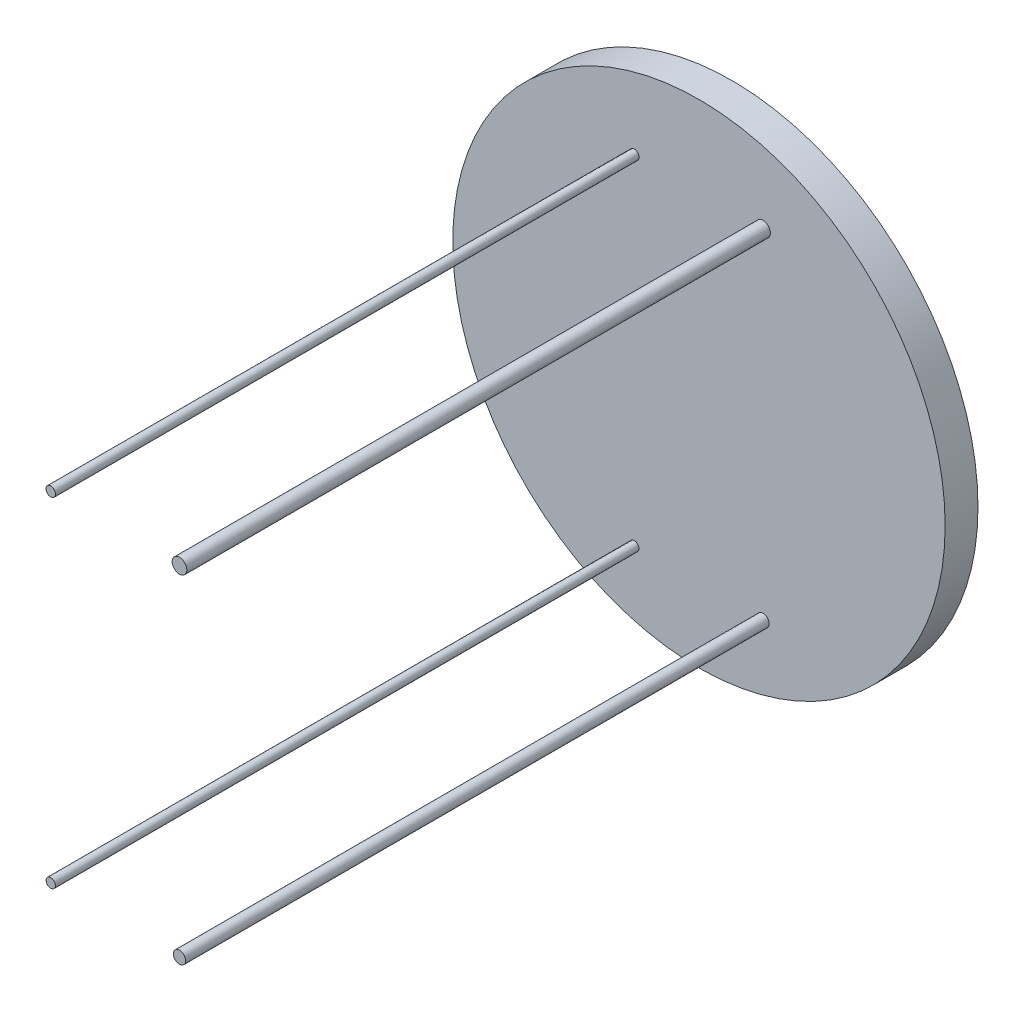
ISO-10303-21;
HEADER;
FILE_DESCRIPTION(('STEP AP214'),'2;1');
FILE_NAME('part.step','',(''),(''),'','','');
FILE_SCHEMA(('AUTOMOTIVE_DESIGN { 1 0 10303 214 1 1 1 1 }'));
ENDSEC;
DATA;
#1=APPLICATION_CONTEXT('core data for automotive mechanical design processes');
#2=APPLICATION_PROTOCOL_DEFINITION('international standard','automotive_design',2000,#1);
#3=PRODUCT_CONTEXT('',#1,'mechanical');
#4=PRODUCT('Part','Part','',(#3));
#5=PRODUCT_RELATED_PRODUCT_CATEGORY('part','',(#4));
#6=PRODUCT_DEFINITION_FORMATION('','',#4);
#7=PRODUCT_DEFINITION_CONTEXT('part definition',#1,'design');
#8=PRODUCT_DEFINITION('design','',#6,#7);
#9=PRODUCT_DEFINITION_SHAPE('','',#8);
#10=(LENGTH_UNIT() NAMED_UNIT(*) SI_UNIT(.MILLI.,.METRE.));
#11=(NAMED_UNIT(*) PLANE_ANGLE_UNIT() SI_UNIT($,.RADIAN.));
#12=(NAMED_UNIT(*) SI_UNIT($,.STERADIAN.) SOLID_ANGLE_UNIT());
#13=UNCERTAINTY_MEASURE_WITH_UNIT(LENGTH_MEASURE(1.E-05),#10,'distance_accuracy_value','');
#14=(GEOMETRIC_REPRESENTATION_CONTEXT(3) GLOBAL_UNCERTAINTY_ASSIGNED_CONTEXT((#13)) GLOBAL_UNIT_ASSIGNED_CONTEXT((#10,
#11,#12)) REPRESENTATION_CONTEXT('',''));
#15=CARTESIAN_POINT('',(0.,0.,0.));
#16=DIRECTION('',(0.,0.,1.));
#17=DIRECTION('',(1.,0.,0.));
#18=AXIS2_PLACEMENT_3D('',#15,#16,#17);
#19=CARTESIAN_POINT('',(833.930631375601,-1197.16637306014,769.51077616825));
#20=DIRECTION('',(0.,0.,1.));
#21=DIRECTION('',(1.,0.,0.));
#22=AXIS2_PLACEMENT_3D('',#19,#20,#21);
#23=CYLINDRICAL_SURFACE('',#22,1304.09277986268);
#24=CARTESIAN_POINT('',(833.930631375601,-1197.16637306014,769.51077616825));
#25=DIRECTION('',(0.,0.,1.));
#26=DIRECTION('',(1.,0.,0.));
#27=AXIS2_PLACEMENT_3D('',#24,#25,#26);
#28=CIRCLE('',#27,1304.09277986268);
#29=CARTESIAN_POINT('',(2138.02341123828,-1197.16637306014,769.51077616825));
#30=VERTEX_POINT('',#29);
#31=EDGE_CURVE('E10',#30,#30,#28,.T.);
#32=ORIENTED_EDGE('',*,*,#31,.T.);
#33=EDGE_LOOP('',(#32));
#34=FACE_BOUND('',#33,.T.);
#35=CARTESIAN_POINT('',(833.930631375601,-1197.16637306014,943.51077616825));
#36=DIRECTION('',(0.,0.,1.));
#37=DIRECTION('',(1.,0.,0.));
#38=AXIS2_PLACEMENT_3D('',#35,#36,#37);
#39=CIRCLE('',#38,1304.09277986268);
#40=CARTESIAN_POINT('',(2138.02341123828,-1197.16637306014,943.51077616825));
#41=VERTEX_POINT('',#40);
#42=EDGE_CURVE('E40',#41,#41,#39,.T.);
#43=ORIENTED_EDGE('',*,*,#42,.F.);
#44=EDGE_LOOP('',(#43));
#45=FACE_BOUND('',#44,.T.);
#46=ADVANCED_FACE('F37',(#34,#45),#23,.T.);
#47=CARTESIAN_POINT('',(833.930631375601,-1197.16637306014,769.51077616825));
#48=DIRECTION('',(0.,0.,1.));
#49=DIRECTION('',(1.,0.,0.));
#50=AXIS2_PLACEMENT_3D('',#47,#48,#49);
#51=PLANE('',#50);
#52=ORIENTED_EDGE('',*,*,#31,.F.);
#53=EDGE_LOOP('',(#52));
#54=FACE_BOUND('',#53,.T.);
#55=ADVANCED_FACE('F96',(#54),#51,.F.);
#56=CARTESIAN_POINT('',(833.930631375601,-1197.16637306014,943.51077616825));
#57=DIRECTION('',(0.,0.,1.));
#58=DIRECTION('',(1.,0.,0.));
#59=AXIS2_PLACEMENT_3D('',#56,#57,#58);
#60=PLANE('',#59);
#61=CARTESIAN_POINT('',(1173.63922552686,-2112.86084923489,943.51077616825));
#62=DIRECTION('',(0.,0.,1.));
#63=DIRECTION('',(1.,0.,0.));
#64=AXIS2_PLACEMENT_3D('',#61,#62,#63);
#65=CIRCLE('',#64,32.2544928425061);
#66=CARTESIAN_POINT('',(1205.89371836936,-2112.86084923489,943.51077616825));
#67=VERTEX_POINT('',#66);
#68=EDGE_CURVE('E75',#67,#67,#65,.T.);
#69=ORIENTED_EDGE('',*,*,#68,.F.);
#70=EDGE_LOOP('',(#69));
#71=FACE_BOUND('',#70,.T.);
#72=CARTESIAN_POINT('',(491.765116757733,-2112.86084923489,943.51077616825));
#73=DIRECTION('',(0.,0.,1.));
#74=DIRECTION('',(1.,0.,0.));
#75=AXIS2_PLACEMENT_3D('',#72,#73,#74);
#76=CIRCLE('',#75,24.5210757220367);
#77=CARTESIAN_POINT('',(516.28619247977,-2112.86084923489,943.51077616825));
#78=VERTEX_POINT('',#77);
#79=EDGE_CURVE('E67',#78,#78,#76,.T.);
#80=ORIENTED_EDGE('',*,*,#79,.F.);
#81=EDGE_LOOP('',(#80));
#82=FACE_BOUND('',#81,.T.);
#83=CARTESIAN_POINT('',(491.765116757733,-317.201613393006,943.51077616825));
#84=DIRECTION('',(0.,0.,1.));
#85=DIRECTION('',(1.,0.,0.));
#86=AXIS2_PLACEMENT_3D('',#83,#84,#85);
#87=CIRCLE('',#86,25.1929811721061);
#88=CARTESIAN_POINT('',(516.958097929839,-317.201613393006,943.51077616825));
#89=VERTEX_POINT('',#88);
#90=EDGE_CURVE('E59',#89,#89,#87,.T.);
#91=ORIENTED_EDGE('',*,*,#90,.F.);
#92=EDGE_LOOP('',(#91));
#93=FACE_BOUND('',#92,.T.);
#94=CARTESIAN_POINT('',(1173.63922552686,-317.201613393006,943.51077616825));
#95=DIRECTION('',(0.,0.,1.));
#96=DIRECTION('',(1.,0.,0.));
#97=AXIS2_PLACEMENT_3D('',#94,#95,#96);
#98=CIRCLE('',#97,38.7717152851179);
#99=CARTESIAN_POINT('',(1212.41094081198,-317.201613393006,943.51077616825));
#100=VERTEX_POINT('',#99);
#101=EDGE_CURVE('E51',#100,#100,#98,.T.);
#102=ORIENTED_EDGE('',*,*,#101,.F.);
#103=EDGE_LOOP('',(#102));
#104=FACE_BOUND('',#103,.T.);
#105=ORIENTED_EDGE('',*,*,#42,.T.);
#106=EDGE_LOOP('',(#105));
#107=FACE_BOUND('',#106,.T.);
#108=ADVANCED_FACE('F92',(#71,#82,#93,#104,#107),#60,.T.);
#109=CARTESIAN_POINT('',(1173.63922552686,-317.201613393006,4034.51077616825));
#110=DIRECTION('',(0.,0.,-1.));
#111=DIRECTION('',(-1.,0.,0.));
#112=AXIS2_PLACEMENT_3D('',#109,#110,#111);
#113=CYLINDRICAL_SURFACE('',#112,38.7717152851179);
#114=CARTESIAN_POINT('',(1173.63922552686,-317.201613393006,4034.51077616825));
#115=DIRECTION('',(0.,0.,1.));
#116=DIRECTION('',(1.,0.,0.));
#117=AXIS2_PLACEMENT_3D('',#114,#115,#116);
#118=CIRCLE('',#117,38.7717152851179);
#119=CARTESIAN_POINT('',(1212.41094081198,-317.201613393006,4034.51077616825));
#120=VERTEX_POINT('',#119);
#121=EDGE_CURVE('E49',#120,#120,#118,.T.);
#122=ORIENTED_EDGE('',*,*,#121,.F.);
#123=EDGE_LOOP('',(#122));
#124=FACE_BOUND('',#123,.T.);
#125=ORIENTED_EDGE('',*,*,#101,.T.);
#126=EDGE_LOOP('',(#125));
#127=FACE_BOUND('',#126,.T.);
#128=ADVANCED_FACE('F95',(#124,#127),#113,.T.);
#129=CARTESIAN_POINT('',(1173.63922552686,-317.201613393006,4034.51077616825));
#130=DIRECTION('',(0.,0.,1.));
#131=DIRECTION('',(1.,0.,0.));
#132=AXIS2_PLACEMENT_3D('',#129,#130,#131);
#133=PLANE('',#132);
#134=ORIENTED_EDGE('',*,*,#121,.T.);
#135=EDGE_LOOP('',(#134));
#136=FACE_BOUND('',#135,.T.);
#137=ADVANCED_FACE('F117',(#136),#133,.T.);
#138=CARTESIAN_POINT('',(491.765116757733,-317.201613393006,4034.51077616825));
#139=DIRECTION('',(0.,0.,-1.));
#140=DIRECTION('',(-1.,0.,0.));
#141=AXIS2_PLACEMENT_3D('',#138,#139,#140);
#142=CYLINDRICAL_SURFACE('',#141,25.1929811721061);
#143=CARTESIAN_POINT('',(491.765116757733,-317.201613393006,4034.51077616825));
#144=DIRECTION('',(0.,0.,1.));
#145=DIRECTION('',(1.,0.,0.));
#146=AXIS2_PLACEMENT_3D('',#143,#144,#145);
#147=CIRCLE('',#146,25.1929811721061);
#148=CARTESIAN_POINT('',(516.958097929839,-317.201613393006,4034.51077616825));
#149=VERTEX_POINT('',#148);
#150=EDGE_CURVE('E55',#149,#149,#147,.T.);
#151=ORIENTED_EDGE('',*,*,#150,.F.);
#152=EDGE_LOOP('',(#151));
#153=FACE_BOUND('',#152,.T.);
#154=ORIENTED_EDGE('',*,*,#90,.T.);
#155=EDGE_LOOP('',(#154));
#156=FACE_BOUND('',#155,.T.);
#157=ADVANCED_FACE('F121',(#153,#156),#142,.T.);
#158=CARTESIAN_POINT('',(491.765116757733,-317.201613393006,4034.51077616825));
#159=DIRECTION('',(0.,0.,1.));
#160=DIRECTION('',(1.,0.,0.));
#161=AXIS2_PLACEMENT_3D('',#158,#159,#160);
#162=PLANE('',#161);
#163=ORIENTED_EDGE('',*,*,#150,.T.);
#164=EDGE_LOOP('',(#163));
#165=FACE_BOUND('',#164,.T.);
#166=ADVANCED_FACE('F125',(#165),#162,.T.);
#167=CARTESIAN_POINT('',(491.765116757733,-2112.86084923489,4034.51077616825));
#168=DIRECTION('',(0.,0.,-1.));
#169=DIRECTION('',(-1.,0.,0.));
#170=AXIS2_PLACEMENT_3D('',#167,#168,#169);
#171=CYLINDRICAL_SURFACE('',#170,24.5210757220367);
#172=CARTESIAN_POINT('',(491.765116757733,-2112.86084923489,4034.51077616825));
#173=DIRECTION('',(0.,0.,1.));
#174=DIRECTION('',(1.,0.,0.));
#175=AXIS2_PLACEMENT_3D('',#172,#173,#174);
#176=CIRCLE('',#175,24.5210757220367);
#177=CARTESIAN_POINT('',(516.28619247977,-2112.86084923489,4034.51077616825));
#178=VERTEX_POINT('',#177);
#179=EDGE_CURVE('E63',#178,#178,#176,.T.);
#180=ORIENTED_EDGE('',*,*,#179,.F.);
#181=EDGE_LOOP('',(#180));
#182=FACE_BOUND('',#181,.T.);
#183=ORIENTED_EDGE('',*,*,#79,.T.);
#184=EDGE_LOOP('',(#183));
#185=FACE_BOUND('',#184,.T.);
#186=ADVANCED_FACE('F129',(#182,#185),#171,.T.);
#187=CARTESIAN_POINT('',(491.765116757733,-2112.86084923489,4034.51077616825));
#188=DIRECTION('',(0.,0.,1.));
#189=DIRECTION('',(1.,0.,0.));
#190=AXIS2_PLACEMENT_3D('',#187,#188,#189);
#191=PLANE('',#190);
#192=ORIENTED_EDGE('',*,*,#179,.T.);
#193=EDGE_LOOP('',(#192));
#194=FACE_BOUND('',#193,.T.);
#195=ADVANCED_FACE('F88',(#194),#191,.T.);
#196=CARTESIAN_POINT('',(1173.63922552686,-2112.86084923489,4034.51077616825));
#197=DIRECTION('',(0.,0.,-1.));
#198=DIRECTION('',(-1.,0.,0.));
#199=AXIS2_PLACEMENT_3D('',#196,#197,#198);
#200=CYLINDRICAL_SURFACE('',#199,32.2544928425061);
#201=CARTESIAN_POINT('',(1173.63922552686,-2112.86084923489,4034.51077616825));
#202=DIRECTION('',(0.,0.,1.));
#203=DIRECTION('',(1.,0.,0.));
#204=AXIS2_PLACEMENT_3D('',#201,#202,#203);
#205=CIRCLE('',#204,32.2544928425061);
#206=CARTESIAN_POINT('',(1205.89371836936,-2112.86084923489,4034.51077616825));
#207=VERTEX_POINT('',#206);
#208=EDGE_CURVE('E71',#207,#207,#205,.T.);
#209=ORIENTED_EDGE('',*,*,#208,.F.);
#210=EDGE_LOOP('',(#209));
#211=FACE_BOUND('',#210,.T.);
#212=ORIENTED_EDGE('',*,*,#68,.T.);
#213=EDGE_LOOP('',(#212));
#214=FACE_BOUND('',#213,.T.);
#215=ADVANCED_FACE('F85',(#211,#214),#200,.T.);
#216=CARTESIAN_POINT('',(1173.63922552686,-2112.86084923489,4034.51077616825));
#217=DIRECTION('',(0.,0.,1.));
#218=DIRECTION('',(1.,0.,0.));
#219=AXIS2_PLACEMENT_3D('',#216,#217,#218);
#220=PLANE('',#219);
#221=ORIENTED_EDGE('',*,*,#208,.T.);
#222=EDGE_LOOP('',(#221));
#223=FACE_BOUND('',#222,.T.);
#224=ADVANCED_FACE('F83',(#223),#220,.T.);
#225=CLOSED_SHELL('',(#46,#55,#108,#128,#137,#157,#166,#186,#195,#215,#224));
#226=MANIFOLD_SOLID_BREP('B2',#225);
#227=ADVANCED_BREP_SHAPE_REPRESENTATION('',(#18,#226),#14);
#228=SHAPE_DEFINITION_REPRESENTATION(#9,#227);
ENDSEC;
END-ISO-10303-21;
